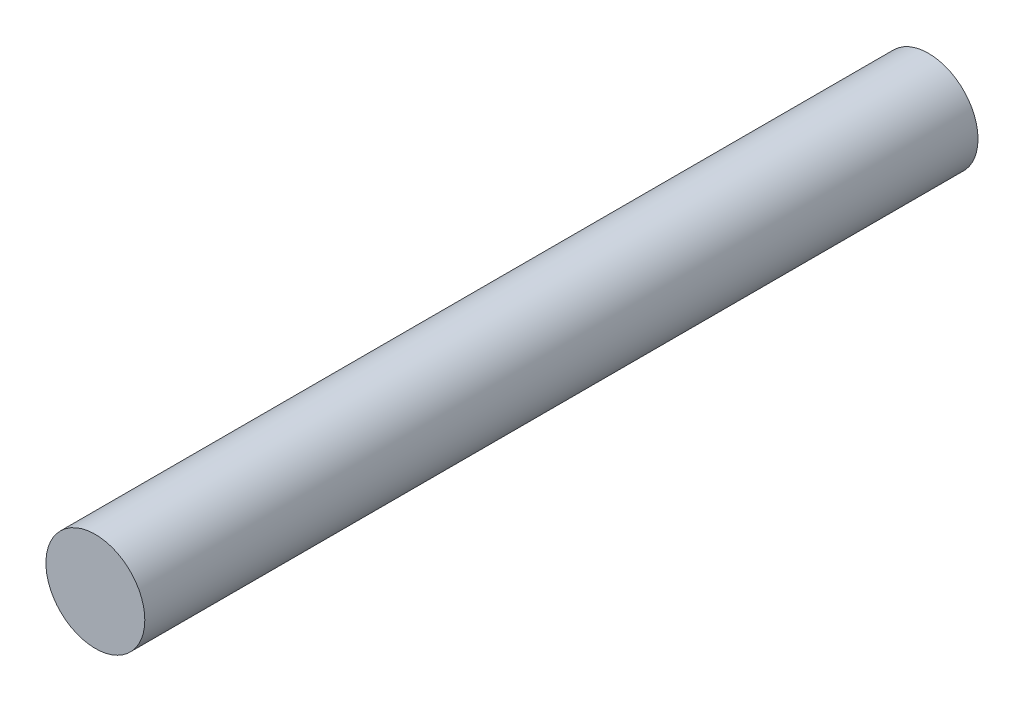
ISO-10303-21;
HEADER;
FILE_DESCRIPTION(('STEP AP214'),'2;1');
FILE_NAME('part.step','',(''),(''),'','','');
FILE_SCHEMA(('AUTOMOTIVE_DESIGN { 1 0 10303 214 1 1 1 1 }'));
ENDSEC;
DATA;
#1=APPLICATION_CONTEXT('core data for automotive mechanical design processes');
#2=APPLICATION_PROTOCOL_DEFINITION('international standard','automotive_design',2000,#1);
#3=PRODUCT_CONTEXT('',#1,'mechanical');
#4=PRODUCT('Part','Part','',(#3));
#5=PRODUCT_RELATED_PRODUCT_CATEGORY('part','',(#4));
#6=PRODUCT_DEFINITION_FORMATION('','',#4);
#7=PRODUCT_DEFINITION_CONTEXT('part definition',#1,'design');
#8=PRODUCT_DEFINITION('design','',#6,#7);
#9=PRODUCT_DEFINITION_SHAPE('','',#8);
#10=(LENGTH_UNIT() NAMED_UNIT(*) SI_UNIT(.MILLI.,.METRE.));
#11=(NAMED_UNIT(*) PLANE_ANGLE_UNIT() SI_UNIT($,.RADIAN.));
#12=(NAMED_UNIT(*) SI_UNIT($,.STERADIAN.) SOLID_ANGLE_UNIT());
#13=UNCERTAINTY_MEASURE_WITH_UNIT(LENGTH_MEASURE(1.E-05),#10,'distance_accuracy_value','');
#14=(GEOMETRIC_REPRESENTATION_CONTEXT(3) GLOBAL_UNCERTAINTY_ASSIGNED_CONTEXT((#13)) GLOBAL_UNIT_ASSIGNED_CONTEXT((#10,
#11,#12)) REPRESENTATION_CONTEXT('',''));
#15=CARTESIAN_POINT('',(0.,0.,0.));
#16=DIRECTION('',(0.,0.,1.));
#17=DIRECTION('',(1.,0.,0.));
#18=AXIS2_PLACEMENT_3D('',#15,#16,#17);
#19=CARTESIAN_POINT('',(0.,0.,33.7));
#20=DIRECTION('',(0.,0.,-1.));
#21=DIRECTION('',(-1.,0.,0.));
#22=AXIS2_PLACEMENT_3D('',#19,#20,#21);
#23=CYLINDRICAL_SURFACE('',#22,2.);
#24=CARTESIAN_POINT('',(0.,0.,33.7));
#25=DIRECTION('',(0.,0.,1.));
#26=DIRECTION('',(1.,0.,0.));
#27=AXIS2_PLACEMENT_3D('',#24,#25,#26);
#28=CIRCLE('',#27,2.);
#29=CARTESIAN_POINT('',(2.,0.,33.7));
#30=VERTEX_POINT('',#29);
#31=EDGE_CURVE('E10',#30,#30,#28,.T.);
#32=ORIENTED_EDGE('',*,*,#31,.F.);
#33=EDGE_LOOP('',(#32));
#34=FACE_BOUND('',#33,.T.);
#35=CARTESIAN_POINT('',(0.,0.,0.));
#36=DIRECTION('',(0.,0.,1.));
#37=DIRECTION('',(1.,0.,0.));
#38=AXIS2_PLACEMENT_3D('',#35,#36,#37);
#39=CIRCLE('',#38,2.);
#40=CARTESIAN_POINT('',(2.,0.,0.));
#41=VERTEX_POINT('',#40);
#42=EDGE_CURVE('E40',#41,#41,#39,.T.);
#43=ORIENTED_EDGE('',*,*,#42,.T.);
#44=EDGE_LOOP('',(#43));
#45=FACE_BOUND('',#44,.T.);
#46=ADVANCED_FACE('F37',(#34,#45),#23,.T.);
#47=CARTESIAN_POINT('',(0.,0.,33.7));
#48=DIRECTION('',(0.,0.,1.));
#49=DIRECTION('',(1.,0.,0.));
#50=AXIS2_PLACEMENT_3D('',#47,#48,#49);
#51=PLANE('',#50);
#52=ORIENTED_EDGE('',*,*,#31,.T.);
#53=EDGE_LOOP('',(#52));
#54=FACE_BOUND('',#53,.T.);
#55=ADVANCED_FACE('F54',(#54),#51,.T.);
#56=CARTESIAN_POINT('',(0.,0.,0.));
#57=DIRECTION('',(0.,0.,1.));
#58=DIRECTION('',(1.,0.,0.));
#59=AXIS2_PLACEMENT_3D('',#56,#57,#58);
#60=PLANE('',#59);
#61=ORIENTED_EDGE('',*,*,#42,.F.);
#62=EDGE_LOOP('',(#61));
#63=FACE_BOUND('',#62,.T.);
#64=ADVANCED_FACE('F52',(#63),#60,.F.);
#65=CLOSED_SHELL('',(#46,#55,#64));
#66=MANIFOLD_SOLID_BREP('B2',#65);
#67=ADVANCED_BREP_SHAPE_REPRESENTATION('',(#18,#66),#14);
#68=SHAPE_DEFINITION_REPRESENTATION(#9,#67);
ENDSEC;
END-ISO-10303-21;
